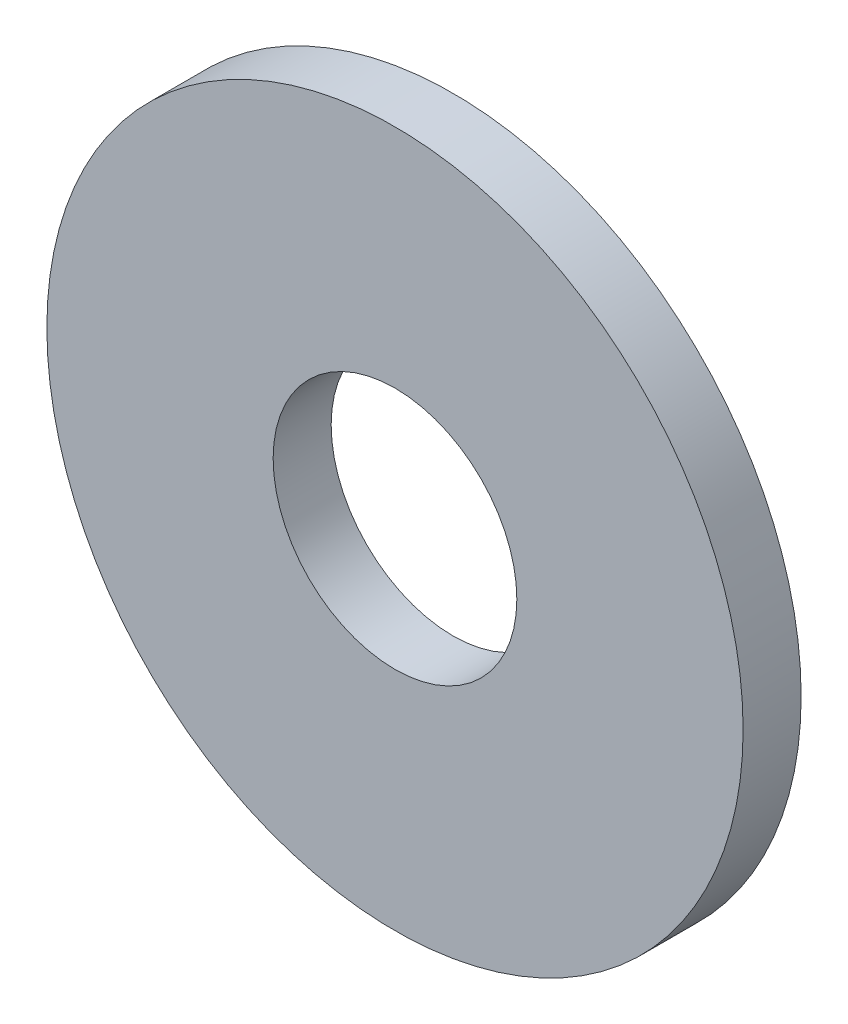
ISO-10303-21;
HEADER;
FILE_DESCRIPTION(('STEP AP214'),'2;1');
FILE_NAME('part.step','',(''),(''),'','','');
FILE_SCHEMA(('AUTOMOTIVE_DESIGN { 1 0 10303 214 1 1 1 1 }'));
ENDSEC;
DATA;
#1=APPLICATION_CONTEXT('core data for automotive mechanical design processes');
#2=APPLICATION_PROTOCOL_DEFINITION('international standard','automotive_design',2000,#1);
#3=PRODUCT_CONTEXT('',#1,'mechanical');
#4=PRODUCT('Part','Part','',(#3));
#5=PRODUCT_RELATED_PRODUCT_CATEGORY('part','',(#4));
#6=PRODUCT_DEFINITION_FORMATION('','',#4);
#7=PRODUCT_DEFINITION_CONTEXT('part definition',#1,'design');
#8=PRODUCT_DEFINITION('design','',#6,#7);
#9=PRODUCT_DEFINITION_SHAPE('','',#8);
#10=(LENGTH_UNIT() NAMED_UNIT(*) SI_UNIT(.MILLI.,.METRE.));
#11=(NAMED_UNIT(*) PLANE_ANGLE_UNIT() SI_UNIT($,.RADIAN.));
#12=(NAMED_UNIT(*) SI_UNIT($,.STERADIAN.) SOLID_ANGLE_UNIT());
#13=UNCERTAINTY_MEASURE_WITH_UNIT(LENGTH_MEASURE(1.E-05),#10,'distance_accuracy_value','');
#14=(GEOMETRIC_REPRESENTATION_CONTEXT(3) GLOBAL_UNCERTAINTY_ASSIGNED_CONTEXT((#13)) GLOBAL_UNIT_ASSIGNED_CONTEXT((#10,
#11,#12)) REPRESENTATION_CONTEXT('',''));
#15=CARTESIAN_POINT('',(0.,0.,0.));
#16=DIRECTION('',(0.,0.,1.));
#17=DIRECTION('',(1.,0.,0.));
#18=AXIS2_PLACEMENT_3D('',#15,#16,#17);
#19=CARTESIAN_POINT('',(0.,0.,5.));
#20=DIRECTION('',(0.,0.,1.));
#21=DIRECTION('',(1.,0.,0.));
#22=AXIS2_PLACEMENT_3D('',#19,#20,#21);
#23=PLANE('',#22);
#24=CARTESIAN_POINT('',(0.,0.,5.));
#25=DIRECTION('',(0.,0.,1.));
#26=DIRECTION('',(1.,0.,0.));
#27=AXIS2_PLACEMENT_3D('',#24,#25,#26);
#28=CIRCLE('',#27,30.);
#29=CARTESIAN_POINT('',(30.,0.,5.));
#30=VERTEX_POINT('',#29);
#31=EDGE_CURVE('E10',#30,#30,#28,.T.);
#32=ORIENTED_EDGE('',*,*,#31,.T.);
#33=EDGE_LOOP('',(#32));
#34=FACE_BOUND('',#33,.T.);
#35=CARTESIAN_POINT('',(0.,0.,5.));
#36=DIRECTION('',(0.,0.,1.));
#37=DIRECTION('',(1.,0.,0.));
#38=AXIS2_PLACEMENT_3D('',#35,#36,#37);
#39=CIRCLE('',#38,10.5);
#40=CARTESIAN_POINT('',(10.5,0.,5.));
#41=VERTEX_POINT('',#40);
#42=EDGE_CURVE('E40',#41,#41,#39,.T.);
#43=ORIENTED_EDGE('',*,*,#42,.F.);
#44=EDGE_LOOP('',(#43));
#45=FACE_BOUND('',#44,.T.);
#46=ADVANCED_FACE('F29',(#34,#45),#23,.T.);
#47=CARTESIAN_POINT('',(0.,0.,0.));
#48=DIRECTION('',(0.,0.,1.));
#49=DIRECTION('',(1.,0.,0.));
#50=AXIS2_PLACEMENT_3D('',#47,#48,#49);
#51=PLANE('',#50);
#52=CARTESIAN_POINT('',(0.,0.,0.));
#53=DIRECTION('',(0.,0.,1.));
#54=DIRECTION('',(1.,0.,0.));
#55=AXIS2_PLACEMENT_3D('',#52,#53,#54);
#56=CIRCLE('',#55,30.);
#57=CARTESIAN_POINT('',(30.,0.,0.));
#58=VERTEX_POINT('',#57);
#59=EDGE_CURVE('E36',#58,#58,#56,.T.);
#60=ORIENTED_EDGE('',*,*,#59,.F.);
#61=EDGE_LOOP('',(#60));
#62=FACE_BOUND('',#61,.T.);
#63=CARTESIAN_POINT('',(0.,0.,0.));
#64=DIRECTION('',(0.,0.,1.));
#65=DIRECTION('',(1.,0.,0.));
#66=AXIS2_PLACEMENT_3D('',#63,#64,#65);
#67=CIRCLE('',#66,10.5);
#68=CARTESIAN_POINT('',(10.5,0.,0.));
#69=VERTEX_POINT('',#68);
#70=EDGE_CURVE('E44',#69,#69,#67,.T.);
#71=ORIENTED_EDGE('',*,*,#70,.T.);
#72=EDGE_LOOP('',(#71));
#73=FACE_BOUND('',#72,.T.);
#74=ADVANCED_FACE('F50',(#62,#73),#51,.F.);
#75=CARTESIAN_POINT('',(0.,0.,5.));
#76=DIRECTION('',(0.,0.,-1.));
#77=DIRECTION('',(-1.,0.,0.));
#78=AXIS2_PLACEMENT_3D('',#75,#76,#77);
#79=CYLINDRICAL_SURFACE('',#78,30.);
#80=ORIENTED_EDGE('',*,*,#31,.F.);
#81=EDGE_LOOP('',(#80));
#82=FACE_BOUND('',#81,.T.);
#83=ORIENTED_EDGE('',*,*,#59,.T.);
#84=EDGE_LOOP('',(#83));
#85=FACE_BOUND('',#84,.T.);
#86=ADVANCED_FACE('F31',(#82,#85),#79,.T.);
#87=CARTESIAN_POINT('',(0.,0.,5.));
#88=DIRECTION('',(0.,0.,-1.));
#89=DIRECTION('',(-1.,0.,0.));
#90=AXIS2_PLACEMENT_3D('',#87,#88,#89);
#91=CYLINDRICAL_SURFACE('',#90,10.5);
#92=ORIENTED_EDGE('',*,*,#42,.T.);
#93=EDGE_LOOP('',(#92));
#94=FACE_BOUND('',#93,.T.);
#95=ORIENTED_EDGE('',*,*,#70,.F.);
#96=EDGE_LOOP('',(#95));
#97=FACE_BOUND('',#96,.T.);
#98=ADVANCED_FACE('F52',(#94,#97),#91,.F.);
#99=CLOSED_SHELL('',(#46,#74,#86,#98));
#100=MANIFOLD_SOLID_BREP('B2',#99);
#101=ADVANCED_BREP_SHAPE_REPRESENTATION('',(#18,#100),#14);
#102=SHAPE_DEFINITION_REPRESENTATION(#9,#101);
ENDSEC;
END-ISO-10303-21;
